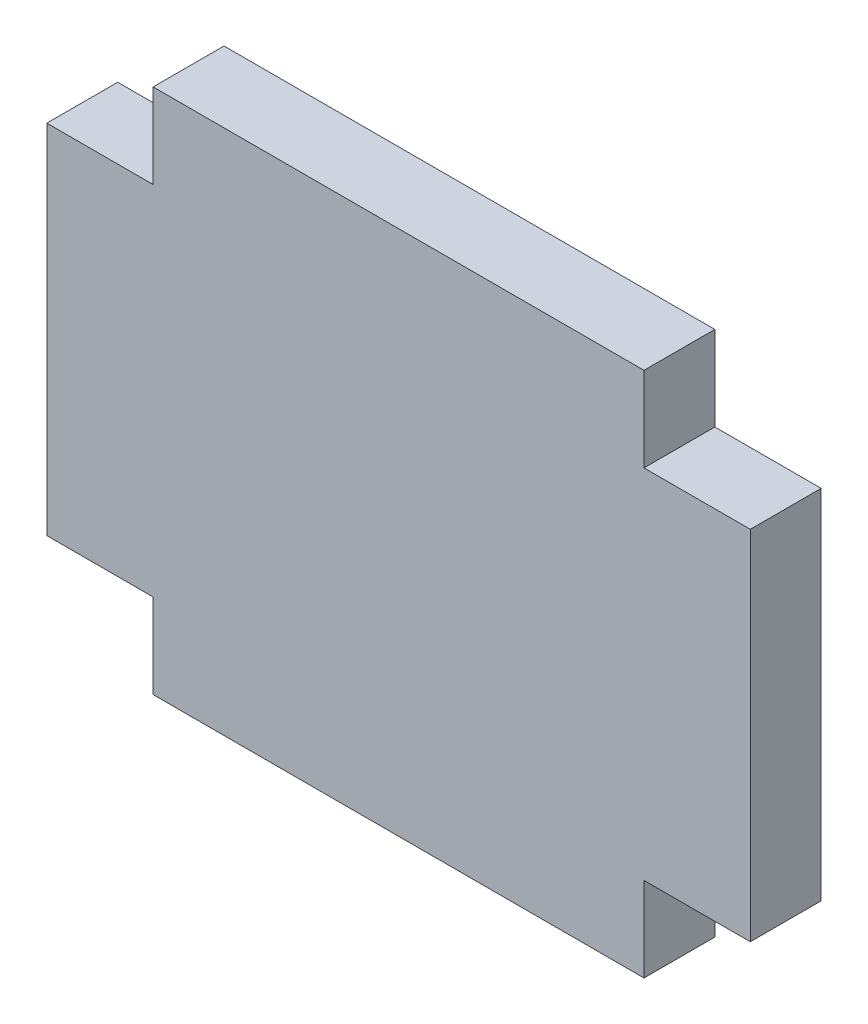
ISO-10303-21;
HEADER;
FILE_DESCRIPTION(('STEP AP214'),'2;1');
FILE_NAME('part.step','',(''),(''),'','','');
FILE_SCHEMA(('AUTOMOTIVE_DESIGN { 1 0 10303 214 1 1 1 1 }'));
ENDSEC;
DATA;
#1=APPLICATION_CONTEXT('core data for automotive mechanical design processes');
#2=APPLICATION_PROTOCOL_DEFINITION('international standard','automotive_design',2000,#1);
#3=PRODUCT_CONTEXT('',#1,'mechanical');
#4=PRODUCT('Part','Part','',(#3));
#5=PRODUCT_RELATED_PRODUCT_CATEGORY('part','',(#4));
#6=PRODUCT_DEFINITION_FORMATION('','',#4);
#7=PRODUCT_DEFINITION_CONTEXT('part definition',#1,'design');
#8=PRODUCT_DEFINITION('design','',#6,#7);
#9=PRODUCT_DEFINITION_SHAPE('','',#8);
#10=(LENGTH_UNIT() NAMED_UNIT(*) SI_UNIT(.MILLI.,.METRE.));
#11=(NAMED_UNIT(*) PLANE_ANGLE_UNIT() SI_UNIT($,.RADIAN.));
#12=(NAMED_UNIT(*) SI_UNIT($,.STERADIAN.) SOLID_ANGLE_UNIT());
#13=UNCERTAINTY_MEASURE_WITH_UNIT(LENGTH_MEASURE(1.E-05),#10,'distance_accuracy_value','');
#14=(GEOMETRIC_REPRESENTATION_CONTEXT(3) GLOBAL_UNCERTAINTY_ASSIGNED_CONTEXT((#13)) GLOBAL_UNIT_ASSIGNED_CONTEXT((#10,
#11,#12)) REPRESENTATION_CONTEXT('',''));
#15=CARTESIAN_POINT('',(0.,0.,0.));
#16=DIRECTION('',(0.,0.,1.));
#17=DIRECTION('',(1.,0.,0.));
#18=AXIS2_PLACEMENT_3D('',#15,#16,#17);
#19=CARTESIAN_POINT('',(52.2630973656898,-3.88842136366278,4.));
#20=DIRECTION('',(0.,-1.,0.));
#21=DIRECTION('',(0.,0.,-1.));
#22=AXIS2_PLACEMENT_3D('',#19,#20,#21);
#23=PLANE('',#22);
#24=DIRECTION('',(-1.,0.,0.));
#25=VECTOR('',#24,1.);
#26=CARTESIAN_POINT('',(52.2630973656898,-3.88842136366278,0.));
#27=LINE('',#26,#25);
#28=CARTESIAN_POINT('',(52.2630973656898,-3.88842136366278,0.));
#29=VERTEX_POINT('',#28);
#30=CARTESIAN_POINT('',(24.5630973656898,-3.88842136366278,0.));
#31=VERTEX_POINT('',#30);
#32=EDGE_CURVE('E164',#29,#31,#27,.T.);
#33=ORIENTED_EDGE('',*,*,#32,.T.);
#34=DIRECTION('',(0.,0.,-1.));
#35=VECTOR('',#34,1.);
#36=CARTESIAN_POINT('',(24.5630973656898,-3.88842136366278,4.));
#37=LINE('',#36,#35);
#38=CARTESIAN_POINT('',(24.5630973656898,-3.88842136366278,4.));
#39=VERTEX_POINT('',#38);
#40=EDGE_CURVE('E11',#39,#31,#37,.T.);
#41=ORIENTED_EDGE('',*,*,#40,.F.);
#42=DIRECTION('',(-1.,0.,0.));
#43=VECTOR('',#42,1.);
#44=CARTESIAN_POINT('',(52.2630973656898,-3.88842136366278,4.));
#45=LINE('',#44,#43);
#46=CARTESIAN_POINT('',(52.2630973656898,-3.88842136366278,4.));
#47=VERTEX_POINT('',#46);
#48=EDGE_CURVE('E198',#47,#39,#45,.T.);
#49=ORIENTED_EDGE('',*,*,#48,.F.);
#50=DIRECTION('',(0.,0.,-1.));
#51=VECTOR('',#50,1.);
#52=CARTESIAN_POINT('',(52.2630973656898,-3.88842136366278,4.));
#53=LINE('',#52,#51);
#54=EDGE_CURVE('E160',#47,#29,#53,.T.);
#55=ORIENTED_EDGE('',*,*,#54,.T.);
#56=EDGE_LOOP('',(#33,#41,#49,#55));
#57=FACE_BOUND('',#56,.T.);
#58=ADVANCED_FACE('F39',(#57),#23,.F.);
#59=CARTESIAN_POINT('',(24.5630973656898,-3.88842136366278,4.));
#60=DIRECTION('',(1.,0.,0.));
#61=DIRECTION('',(0.,1.,0.));
#62=AXIS2_PLACEMENT_3D('',#59,#60,#61);
#63=PLANE('',#62);
#64=DIRECTION('',(0.,-1.,0.));
#65=VECTOR('',#64,1.);
#66=CARTESIAN_POINT('',(24.5630973656898,-3.88842136366278,0.));
#67=LINE('',#66,#65);
#68=CARTESIAN_POINT('',(24.5630973656898,-8.65842136366276,0.));
#69=VERTEX_POINT('',#68);
#70=EDGE_CURVE('E168',#31,#69,#67,.T.);
#71=ORIENTED_EDGE('',*,*,#70,.T.);
#72=DIRECTION('',(0.,0.,-1.));
#73=VECTOR('',#72,1.);
#74=CARTESIAN_POINT('',(24.5630973656898,-8.65842136366276,4.));
#75=LINE('',#74,#73);
#76=CARTESIAN_POINT('',(24.5630973656898,-8.65842136366276,4.));
#77=VERTEX_POINT('',#76);
#78=EDGE_CURVE('E48',#77,#69,#75,.T.);
#79=ORIENTED_EDGE('',*,*,#78,.F.);
#80=DIRECTION('',(0.,-1.,0.));
#81=VECTOR('',#80,1.);
#82=CARTESIAN_POINT('',(24.5630973656898,-3.88842136366278,4.));
#83=LINE('',#82,#81);
#84=EDGE_CURVE('E111',#39,#77,#83,.T.);
#85=ORIENTED_EDGE('',*,*,#84,.F.);
#86=ORIENTED_EDGE('',*,*,#40,.T.);
#87=EDGE_LOOP('',(#71,#79,#85,#86));
#88=FACE_BOUND('',#87,.T.);
#89=ADVANCED_FACE('F292',(#88),#63,.F.);
#90=CARTESIAN_POINT('',(24.5630973656898,-8.65842136366276,4.));
#91=DIRECTION('',(0.,-1.,0.));
#92=DIRECTION('',(0.,0.,-1.));
#93=AXIS2_PLACEMENT_3D('',#90,#91,#92);
#94=PLANE('',#93);
#95=DIRECTION('',(-1.,0.,0.));
#96=VECTOR('',#95,1.);
#97=CARTESIAN_POINT('',(24.5630973656898,-8.65842136366276,0.));
#98=LINE('',#97,#96);
#99=CARTESIAN_POINT('',(18.5630973656898,-8.65842136366276,0.));
#100=VERTEX_POINT('',#99);
#101=EDGE_CURVE('E171',#69,#100,#98,.T.);
#102=ORIENTED_EDGE('',*,*,#101,.T.);
#103=DIRECTION('',(0.,0.,-1.));
#104=VECTOR('',#103,1.);
#105=CARTESIAN_POINT('',(18.5630973656898,-8.65842136366276,4.));
#106=LINE('',#105,#104);
#107=CARTESIAN_POINT('',(18.5630973656898,-8.65842136366276,4.));
#108=VERTEX_POINT('',#107);
#109=EDGE_CURVE('E225',#108,#100,#106,.T.);
#110=ORIENTED_EDGE('',*,*,#109,.F.);
#111=DIRECTION('',(-1.,0.,0.));
#112=VECTOR('',#111,1.);
#113=CARTESIAN_POINT('',(24.5630973656898,-8.65842136366276,4.));
#114=LINE('',#113,#112);
#115=EDGE_CURVE('E235',#77,#108,#114,.T.);
#116=ORIENTED_EDGE('',*,*,#115,.F.);
#117=ORIENTED_EDGE('',*,*,#78,.T.);
#118=EDGE_LOOP('',(#102,#110,#116,#117));
#119=FACE_BOUND('',#118,.T.);
#120=ADVANCED_FACE('F233',(#119),#94,.F.);
#121=CARTESIAN_POINT('',(18.5630973656898,-8.65842136366276,4.));
#122=DIRECTION('',(1.,0.,0.));
#123=DIRECTION('',(0.,0.,-1.));
#124=AXIS2_PLACEMENT_3D('',#121,#122,#123);
#125=PLANE('',#124);
#126=DIRECTION('',(0.,-1.,0.));
#127=VECTOR('',#126,1.);
#128=CARTESIAN_POINT('',(18.5630973656898,-8.65842136366276,0.));
#129=LINE('',#128,#127);
#130=CARTESIAN_POINT('',(18.5630973656898,-28.8184213636628,0.));
#131=VERTEX_POINT('',#130);
#132=EDGE_CURVE('E174',#100,#131,#129,.T.);
#133=ORIENTED_EDGE('',*,*,#132,.T.);
#134=DIRECTION('',(0.,0.,-1.));
#135=VECTOR('',#134,1.);
#136=CARTESIAN_POINT('',(18.5630973656898,-28.8184213636628,4.));
#137=LINE('',#136,#135);
#138=CARTESIAN_POINT('',(18.5630973656898,-28.8184213636628,4.));
#139=VERTEX_POINT('',#138);
#140=EDGE_CURVE('E221',#139,#131,#137,.T.);
#141=ORIENTED_EDGE('',*,*,#140,.F.);
#142=DIRECTION('',(0.,-1.,0.));
#143=VECTOR('',#142,1.);
#144=CARTESIAN_POINT('',(18.5630973656898,-8.65842136366276,4.));
#145=LINE('',#144,#143);
#146=EDGE_CURVE('E254',#108,#139,#145,.T.);
#147=ORIENTED_EDGE('',*,*,#146,.F.);
#148=ORIENTED_EDGE('',*,*,#109,.T.);
#149=EDGE_LOOP('',(#133,#141,#147,#148));
#150=FACE_BOUND('',#149,.T.);
#151=ADVANCED_FACE('F244',(#150),#125,.F.);
#152=CARTESIAN_POINT('',(18.5630973656898,-28.8184213636628,4.));
#153=DIRECTION('',(0.,1.,0.));
#154=DIRECTION('',(-1.,0.,0.));
#155=AXIS2_PLACEMENT_3D('',#152,#153,#154);
#156=PLANE('',#155);
#157=DIRECTION('',(1.,0.,0.));
#158=VECTOR('',#157,1.);
#159=CARTESIAN_POINT('',(18.5630973656898,-28.8184213636628,0.));
#160=LINE('',#159,#158);
#161=CARTESIAN_POINT('',(24.5630973656898,-28.8184213636628,0.));
#162=VERTEX_POINT('',#161);
#163=EDGE_CURVE('E177',#131,#162,#160,.T.);
#164=ORIENTED_EDGE('',*,*,#163,.T.);
#165=DIRECTION('',(0.,0.,-1.));
#166=VECTOR('',#165,1.);
#167=CARTESIAN_POINT('',(24.5630973656898,-28.8184213636628,4.));
#168=LINE('',#167,#166);
#169=CARTESIAN_POINT('',(24.5630973656898,-28.8184213636628,4.));
#170=VERTEX_POINT('',#169);
#171=EDGE_CURVE('E217',#170,#162,#168,.T.);
#172=ORIENTED_EDGE('',*,*,#171,.F.);
#173=DIRECTION('',(1.,0.,0.));
#174=VECTOR('',#173,1.);
#175=CARTESIAN_POINT('',(18.5630973656898,-28.8184213636628,4.));
#176=LINE('',#175,#174);
#177=EDGE_CURVE('E250',#139,#170,#176,.T.);
#178=ORIENTED_EDGE('',*,*,#177,.F.);
#179=ORIENTED_EDGE('',*,*,#140,.T.);
#180=EDGE_LOOP('',(#164,#172,#178,#179));
#181=FACE_BOUND('',#180,.T.);
#182=ADVANCED_FACE('F248',(#181),#156,.F.);
#183=CARTESIAN_POINT('',(24.5630973656898,-28.8184213636628,4.));
#184=DIRECTION('',(1.,0.,0.));
#185=DIRECTION('',(0.,0.,-1.));
#186=AXIS2_PLACEMENT_3D('',#183,#184,#185);
#187=PLANE('',#186);
#188=DIRECTION('',(0.,-1.,0.));
#189=VECTOR('',#188,1.);
#190=CARTESIAN_POINT('',(24.5630973656898,-28.8184213636628,0.));
#191=LINE('',#190,#189);
#192=CARTESIAN_POINT('',(24.5630973656898,-33.5884213636628,0.));
#193=VERTEX_POINT('',#192);
#194=EDGE_CURVE('E180',#162,#193,#191,.T.);
#195=ORIENTED_EDGE('',*,*,#194,.T.);
#196=DIRECTION('',(0.,0.,-1.));
#197=VECTOR('',#196,1.);
#198=CARTESIAN_POINT('',(24.5630973656898,-33.5884213636628,4.));
#199=LINE('',#198,#197);
#200=CARTESIAN_POINT('',(24.5630973656898,-33.5884213636628,4.));
#201=VERTEX_POINT('',#200);
#202=EDGE_CURVE('E213',#201,#193,#199,.T.);
#203=ORIENTED_EDGE('',*,*,#202,.F.);
#204=DIRECTION('',(0.,-1.,0.));
#205=VECTOR('',#204,1.);
#206=CARTESIAN_POINT('',(24.5630973656898,-28.8184213636628,4.));
#207=LINE('',#206,#205);
#208=EDGE_CURVE('E253',#170,#201,#207,.T.);
#209=ORIENTED_EDGE('',*,*,#208,.F.);
#210=ORIENTED_EDGE('',*,*,#171,.T.);
#211=EDGE_LOOP('',(#195,#203,#209,#210));
#212=FACE_BOUND('',#211,.T.);
#213=ADVANCED_FACE('F305',(#212),#187,.F.);
#214=CARTESIAN_POINT('',(24.5630973656898,-33.5884213636628,4.));
#215=DIRECTION('',(0.,1.,0.));
#216=DIRECTION('',(0.,0.,1.));
#217=AXIS2_PLACEMENT_3D('',#214,#215,#216);
#218=PLANE('',#217);
#219=DIRECTION('',(1.,0.,0.));
#220=VECTOR('',#219,1.);
#221=CARTESIAN_POINT('',(24.5630973656898,-33.5884213636628,0.));
#222=LINE('',#221,#220);
#223=CARTESIAN_POINT('',(52.2630973656898,-33.5884213636628,0.));
#224=VERTEX_POINT('',#223);
#225=EDGE_CURVE('E183',#193,#224,#222,.T.);
#226=ORIENTED_EDGE('',*,*,#225,.T.);
#227=DIRECTION('',(0.,0.,-1.));
#228=VECTOR('',#227,1.);
#229=CARTESIAN_POINT('',(52.2630973656898,-33.5884213636628,4.));
#230=LINE('',#229,#228);
#231=CARTESIAN_POINT('',(52.2630973656898,-33.5884213636628,4.));
#232=VERTEX_POINT('',#231);
#233=EDGE_CURVE('E209',#232,#224,#230,.T.);
#234=ORIENTED_EDGE('',*,*,#233,.F.);
#235=DIRECTION('',(1.,0.,0.));
#236=VECTOR('',#235,1.);
#237=CARTESIAN_POINT('',(24.5630973656898,-33.5884213636628,4.));
#238=LINE('',#237,#236);
#239=EDGE_CURVE('E258',#201,#232,#238,.T.);
#240=ORIENTED_EDGE('',*,*,#239,.F.);
#241=ORIENTED_EDGE('',*,*,#202,.T.);
#242=EDGE_LOOP('',(#226,#234,#240,#241));
#243=FACE_BOUND('',#242,.T.);
#244=ADVANCED_FACE('F308',(#243),#218,.F.);
#245=CARTESIAN_POINT('',(52.2630973656898,-33.5884213636628,4.));
#246=DIRECTION('',(-1.,0.,0.));
#247=DIRECTION('',(0.,0.,1.));
#248=AXIS2_PLACEMENT_3D('',#245,#246,#247);
#249=PLANE('',#248);
#250=DIRECTION('',(0.,1.,0.));
#251=VECTOR('',#250,1.);
#252=CARTESIAN_POINT('',(52.2630973656898,-33.5884213636628,0.));
#253=LINE('',#252,#251);
#254=CARTESIAN_POINT('',(52.2630973656898,-28.8184213636627,0.));
#255=VERTEX_POINT('',#254);
#256=EDGE_CURVE('E186',#224,#255,#253,.T.);
#257=ORIENTED_EDGE('',*,*,#256,.T.);
#258=DIRECTION('',(0.,0.,-1.));
#259=VECTOR('',#258,1.);
#260=CARTESIAN_POINT('',(52.2630973656898,-28.8184213636627,4.));
#261=LINE('',#260,#259);
#262=CARTESIAN_POINT('',(52.2630973656898,-28.8184213636627,4.));
#263=VERTEX_POINT('',#262);
#264=EDGE_CURVE('E205',#263,#255,#261,.T.);
#265=ORIENTED_EDGE('',*,*,#264,.F.);
#266=DIRECTION('',(0.,1.,0.));
#267=VECTOR('',#266,1.);
#268=CARTESIAN_POINT('',(52.2630973656898,-33.5884213636628,4.));
#269=LINE('',#268,#267);
#270=EDGE_CURVE('E265',#232,#263,#269,.T.);
#271=ORIENTED_EDGE('',*,*,#270,.F.);
#272=ORIENTED_EDGE('',*,*,#233,.T.);
#273=EDGE_LOOP('',(#257,#265,#271,#272));
#274=FACE_BOUND('',#273,.T.);
#275=ADVANCED_FACE('F273',(#274),#249,.F.);
#276=CARTESIAN_POINT('',(52.2630973656898,-28.8184213636627,4.));
#277=DIRECTION('',(0.,1.,0.));
#278=DIRECTION('',(0.,0.,1.));
#279=AXIS2_PLACEMENT_3D('',#276,#277,#278);
#280=PLANE('',#279);
#281=DIRECTION('',(1.,0.,0.));
#282=VECTOR('',#281,1.);
#283=CARTESIAN_POINT('',(52.2630973656898,-28.8184213636627,0.));
#284=LINE('',#283,#282);
#285=CARTESIAN_POINT('',(58.2630973656898,-28.8184213636627,0.));
#286=VERTEX_POINT('',#285);
#287=EDGE_CURVE('E189',#255,#286,#284,.T.);
#288=ORIENTED_EDGE('',*,*,#287,.T.);
#289=DIRECTION('',(0.,0.,-1.));
#290=VECTOR('',#289,1.);
#291=CARTESIAN_POINT('',(58.2630973656898,-28.8184213636627,4.));
#292=LINE('',#291,#290);
#293=CARTESIAN_POINT('',(58.2630973656898,-28.8184213636627,4.));
#294=VERTEX_POINT('',#293);
#295=EDGE_CURVE('E153',#294,#286,#292,.T.);
#296=ORIENTED_EDGE('',*,*,#295,.F.);
#297=DIRECTION('',(1.,0.,0.));
#298=VECTOR('',#297,1.);
#299=CARTESIAN_POINT('',(52.2630973656898,-28.8184213636627,4.));
#300=LINE('',#299,#298);
#301=EDGE_CURVE('E142',#263,#294,#300,.T.);
#302=ORIENTED_EDGE('',*,*,#301,.F.);
#303=ORIENTED_EDGE('',*,*,#264,.T.);
#304=EDGE_LOOP('',(#288,#296,#302,#303));
#305=FACE_BOUND('',#304,.T.);
#306=ADVANCED_FACE('F277',(#305),#280,.F.);
#307=CARTESIAN_POINT('',(58.2630973656898,-28.8184213636627,4.));
#308=DIRECTION('',(-1.,0.,0.));
#309=DIRECTION('',(0.,0.,1.));
#310=AXIS2_PLACEMENT_3D('',#307,#308,#309);
#311=PLANE('',#310);
#312=DIRECTION('',(0.,1.,0.));
#313=VECTOR('',#312,1.);
#314=CARTESIAN_POINT('',(58.2630973656898,-28.8184213636627,0.));
#315=LINE('',#314,#313);
#316=CARTESIAN_POINT('',(58.2630973656898,-8.65842136366274,0.));
#317=VERTEX_POINT('',#316);
#318=EDGE_CURVE('E151',#286,#317,#315,.T.);
#319=ORIENTED_EDGE('',*,*,#318,.T.);
#320=DIRECTION('',(0.,0.,-1.));
#321=VECTOR('',#320,1.);
#322=CARTESIAN_POINT('',(58.2630973656898,-8.65842136366274,4.));
#323=LINE('',#322,#321);
#324=CARTESIAN_POINT('',(58.2630973656898,-8.65842136366274,4.));
#325=VERTEX_POINT('',#324);
#326=EDGE_CURVE('E148',#325,#317,#323,.T.);
#327=ORIENTED_EDGE('',*,*,#326,.F.);
#328=DIRECTION('',(0.,1.,0.));
#329=VECTOR('',#328,1.);
#330=CARTESIAN_POINT('',(58.2630973656898,-28.8184213636627,4.));
#331=LINE('',#330,#329);
#332=EDGE_CURVE('E136',#294,#325,#331,.T.);
#333=ORIENTED_EDGE('',*,*,#332,.F.);
#334=ORIENTED_EDGE('',*,*,#295,.T.);
#335=EDGE_LOOP('',(#319,#327,#333,#334));
#336=FACE_BOUND('',#335,.T.);
#337=ADVANCED_FACE('F149',(#336),#311,.F.);
#338=CARTESIAN_POINT('',(58.2630973656898,-8.65842136366274,4.));
#339=DIRECTION('',(0.,-1.,0.));
#340=DIRECTION('',(0.,0.,-1.));
#341=AXIS2_PLACEMENT_3D('',#338,#339,#340);
#342=PLANE('',#341);
#343=DIRECTION('',(-1.,0.,0.));
#344=VECTOR('',#343,1.);
#345=CARTESIAN_POINT('',(58.2630973656898,-8.65842136366274,0.));
#346=LINE('',#345,#344);
#347=CARTESIAN_POINT('',(52.2630973656898,-8.65842136366274,0.));
#348=VERTEX_POINT('',#347);
#349=EDGE_CURVE('E97',#317,#348,#346,.T.);
#350=ORIENTED_EDGE('',*,*,#349,.T.);
#351=DIRECTION('',(0.,0.,-1.));
#352=VECTOR('',#351,1.);
#353=CARTESIAN_POINT('',(52.2630973656898,-8.65842136366274,4.));
#354=LINE('',#353,#352);
#355=CARTESIAN_POINT('',(52.2630973656898,-8.65842136366274,4.));
#356=VERTEX_POINT('',#355);
#357=EDGE_CURVE('E154',#356,#348,#354,.T.);
#358=ORIENTED_EDGE('',*,*,#357,.F.);
#359=DIRECTION('',(-1.,0.,0.));
#360=VECTOR('',#359,1.);
#361=CARTESIAN_POINT('',(58.2630973656898,-8.65842136366274,4.));
#362=LINE('',#361,#360);
#363=EDGE_CURVE('E140',#325,#356,#362,.T.);
#364=ORIENTED_EDGE('',*,*,#363,.F.);
#365=ORIENTED_EDGE('',*,*,#326,.T.);
#366=EDGE_LOOP('',(#350,#358,#364,#365));
#367=FACE_BOUND('',#366,.T.);
#368=ADVANCED_FACE('F156',(#367),#342,.F.);
#369=CARTESIAN_POINT('',(52.2630973656898,-8.65842136366274,4.));
#370=DIRECTION('',(-1.,0.,0.));
#371=DIRECTION('',(0.,0.,1.));
#372=AXIS2_PLACEMENT_3D('',#369,#370,#371);
#373=PLANE('',#372);
#374=DIRECTION('',(0.,1.,0.));
#375=VECTOR('',#374,1.);
#376=CARTESIAN_POINT('',(52.2630973656898,-8.65842136366274,0.));
#377=LINE('',#376,#375);
#378=EDGE_CURVE('E103',#348,#29,#377,.T.);
#379=ORIENTED_EDGE('',*,*,#378,.T.);
#380=ORIENTED_EDGE('',*,*,#54,.F.);
#381=DIRECTION('',(0.,1.,0.));
#382=VECTOR('',#381,1.);
#383=CARTESIAN_POINT('',(52.2630973656898,-8.65842136366274,4.));
#384=LINE('',#383,#382);
#385=EDGE_CURVE('E56',#356,#47,#384,.T.);
#386=ORIENTED_EDGE('',*,*,#385,.F.);
#387=ORIENTED_EDGE('',*,*,#357,.T.);
#388=EDGE_LOOP('',(#379,#380,#386,#387));
#389=FACE_BOUND('',#388,.T.);
#390=ADVANCED_FACE('F281',(#389),#373,.F.);
#391=CARTESIAN_POINT('',(0.,0.,4.));
#392=DIRECTION('',(0.,0.,1.));
#393=DIRECTION('',(1.,0.,0.));
#394=AXIS2_PLACEMENT_3D('',#391,#392,#393);
#395=PLANE('',#394);
#396=ORIENTED_EDGE('',*,*,#48,.T.);
#397=ORIENTED_EDGE('',*,*,#84,.T.);
#398=ORIENTED_EDGE('',*,*,#115,.T.);
#399=ORIENTED_EDGE('',*,*,#146,.T.);
#400=ORIENTED_EDGE('',*,*,#177,.T.);
#401=ORIENTED_EDGE('',*,*,#208,.T.);
#402=ORIENTED_EDGE('',*,*,#239,.T.);
#403=ORIENTED_EDGE('',*,*,#270,.T.);
#404=ORIENTED_EDGE('',*,*,#301,.T.);
#405=ORIENTED_EDGE('',*,*,#332,.T.);
#406=ORIENTED_EDGE('',*,*,#363,.T.);
#407=ORIENTED_EDGE('',*,*,#385,.T.);
#408=EDGE_LOOP('',(#396,#397,#398,#399,#400,#401,#402,#403,#404,#405,#406,#407));
#409=FACE_BOUND('',#408,.T.);
#410=ADVANCED_FACE('F138',(#409),#395,.T.);
#411=CARTESIAN_POINT('',(0.,0.,0.));
#412=DIRECTION('',(0.,0.,1.));
#413=DIRECTION('',(1.,0.,0.));
#414=AXIS2_PLACEMENT_3D('',#411,#412,#413);
#415=PLANE('',#414);
#416=ORIENTED_EDGE('',*,*,#32,.F.);
#417=ORIENTED_EDGE('',*,*,#378,.F.);
#418=ORIENTED_EDGE('',*,*,#349,.F.);
#419=ORIENTED_EDGE('',*,*,#318,.F.);
#420=ORIENTED_EDGE('',*,*,#287,.F.);
#421=ORIENTED_EDGE('',*,*,#256,.F.);
#422=ORIENTED_EDGE('',*,*,#225,.F.);
#423=ORIENTED_EDGE('',*,*,#194,.F.);
#424=ORIENTED_EDGE('',*,*,#163,.F.);
#425=ORIENTED_EDGE('',*,*,#132,.F.);
#426=ORIENTED_EDGE('',*,*,#101,.F.);
#427=ORIENTED_EDGE('',*,*,#70,.F.);
#428=EDGE_LOOP('',(#416,#417,#418,#419,#420,#421,#422,#423,#424,#425,#426,#427));
#429=FACE_BOUND('',#428,.T.);
#430=ADVANCED_FACE('F239',(#429),#415,.F.);
#431=CLOSED_SHELL('',(#58,#89,#120,#151,#182,#213,#244,#275,#306,#337,#368,#390,#410,#430));
#432=MANIFOLD_SOLID_BREP('B2',#431);
#433=ADVANCED_BREP_SHAPE_REPRESENTATION('',(#18,#432),#14);
#434=SHAPE_DEFINITION_REPRESENTATION(#9,#433);
ENDSEC;
END-ISO-10303-21;
